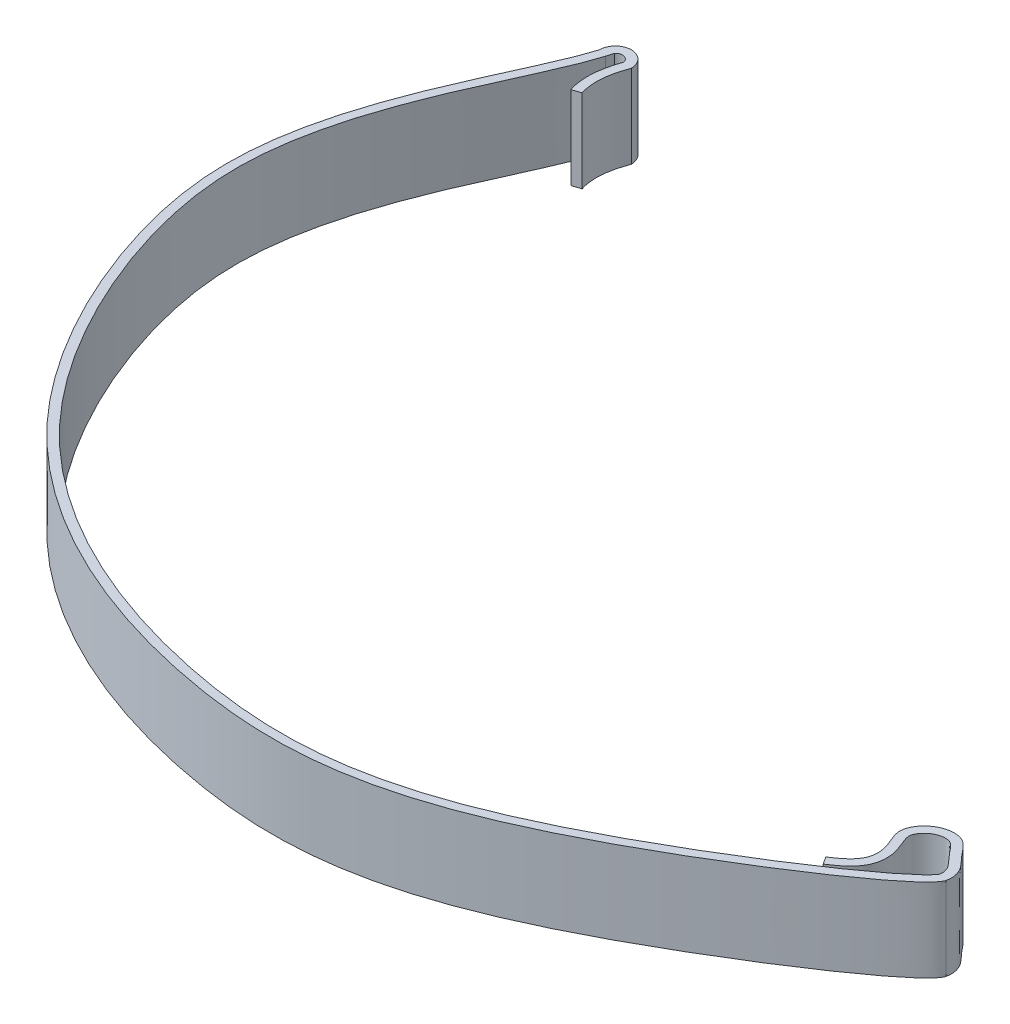
ISO-10303-21;
HEADER;
FILE_DESCRIPTION(('STEP AP214'),'2;1');
FILE_NAME('part.step','',(''),(''),'','','');
FILE_SCHEMA(('AUTOMOTIVE_DESIGN { 1 0 10303 214 1 1 1 1 }'));
ENDSEC;
DATA;
#1=APPLICATION_CONTEXT('core data for automotive mechanical design processes');
#2=APPLICATION_PROTOCOL_DEFINITION('international standard','automotive_design',2000,#1);
#3=PRODUCT_CONTEXT('',#1,'mechanical');
#4=PRODUCT('Part','Part','',(#3));
#5=PRODUCT_RELATED_PRODUCT_CATEGORY('part','',(#4));
#6=PRODUCT_DEFINITION_FORMATION('','',#4);
#7=PRODUCT_DEFINITION_CONTEXT('part definition',#1,'design');
#8=PRODUCT_DEFINITION('design','',#6,#7);
#9=PRODUCT_DEFINITION_SHAPE('','',#8);
#10=(LENGTH_UNIT() NAMED_UNIT(*) SI_UNIT(.MILLI.,.METRE.));
#11=(NAMED_UNIT(*) PLANE_ANGLE_UNIT() SI_UNIT($,.RADIAN.));
#12=(NAMED_UNIT(*) SI_UNIT($,.STERADIAN.) SOLID_ANGLE_UNIT());
#13=UNCERTAINTY_MEASURE_WITH_UNIT(LENGTH_MEASURE(1.E-05),#10,'distance_accuracy_value','');
#14=(GEOMETRIC_REPRESENTATION_CONTEXT(3) GLOBAL_UNCERTAINTY_ASSIGNED_CONTEXT((#13)) GLOBAL_UNIT_ASSIGNED_CONTEXT((#10,
#11,#12)) REPRESENTATION_CONTEXT('',''));
#15=CARTESIAN_POINT('',(0.,0.,0.));
#16=DIRECTION('',(0.,0.,1.));
#17=DIRECTION('',(1.,0.,0.));
#18=AXIS2_PLACEMENT_3D('',#15,#16,#17);
#19=CARTESIAN_POINT('',(94.0066656422718,14.,-10.9398372517862));
#20=CARTESIAN_POINT('',(94.0471251300807,14.,-11.1010481212494));
#21=CARTESIAN_POINT('',(94.0800016351362,14.,-11.4191849300879));
#22=CARTESIAN_POINT('',(93.9917776622486,14.,-11.9967623469634));
#23=CARTESIAN_POINT('',(93.7878079625354,14.,-12.4934423113869));
#24=CARTESIAN_POINT('',(93.4350248525155,14.,-12.9867497881263));
#25=CARTESIAN_POINT('',(92.876442091452,14.,-13.5876331248368));
#26=CARTESIAN_POINT('',(92.1574266539098,14.,-14.3681340525329));
#27=CARTESIAN_POINT('',(91.5439879783252,14.,-15.1578500905497));
#28=CARTESIAN_POINT('',(91.009634751994,14.,-15.8159884814287));
#29=CARTESIAN_POINT('',(90.5207790091255,14.,-16.293163239713));
#30=CARTESIAN_POINT('',(90.143666007239,14.,-16.5335759638733));
#31=CARTESIAN_POINT('',(89.679905116593,14.,-16.6747846550239));
#32=CARTESIAN_POINT('',(88.8749540082731,14.,-16.7167499015573));
#33=CARTESIAN_POINT('',(87.7335789571478,14.,-16.4216760619905));
#34=CARTESIAN_POINT('',(86.737022973381,14.,-15.6619642656265));
#35=CARTESIAN_POINT('',(86.1845488002609,14.,-14.9296165947175));
#36=CARTESIAN_POINT('',(85.9358591644071,14.,-14.3852983890064));
#37=CARTESIAN_POINT('',(85.8569634627461,14.,-13.9472760877937));
#38=CARTESIAN_POINT('',(85.902325330398,14.,-13.5326849558173));
#39=CARTESIAN_POINT('',(86.1203556237079,14.,-12.8592721836979));
#40=CARTESIAN_POINT('',(86.4770840370334,14.,-12.0299593684926));
#41=CARTESIAN_POINT('',(86.8784451989153,14.,-11.0269691118288));
#42=CARTESIAN_POINT('',(87.1650054257999,14.,-9.85035892107503));
#43=CARTESIAN_POINT('',(87.2405050385131,14.,-8.64999768387701));
#44=CARTESIAN_POINT('',(87.0818941394435,14.,-7.41836322487745));
#45=CARTESIAN_POINT('',(86.6100974345486,14.,-6.22438186312387));
#46=CARTESIAN_POINT('',(85.9381941655456,14.,-5.24262753026347));
#47=CARTESIAN_POINT('',(85.1575232671571,14.,-4.41206138085224));
#48=CARTESIAN_POINT('',(84.3305461948477,14.,-3.71066209422711));
#49=CARTESIAN_POINT('',(83.4913510750879,14.,-3.10371430899059));
#50=CARTESIAN_POINT('',(82.9951261635802,14.,-2.77855598688087));
#51=CARTESIAN_POINT('',(82.7354705416507,14.,-2.61161318088103));
#52=B_SPLINE_CURVE_WITH_KNOTS('',3,(#19,#20,#21,#22,#23,#24,#25,#26,#27,#28,#29,#30,#31,#32,#33,
#34,#35,#36,#37,#38,#39,#40,#41,#42,#43,#44,#45,#46,#47,#48,#49,#50,#51),.UNSPECIFIED.,.F.,.F.,
(4,1,1,1,1,1,1,1,1,1,1,1,1,1,1,1,1,1,1,1,1,1,1,1,1,1,1,1,1,1,4),(0.000545476492794976,
0.0317784303523951,0.0630113842119953,0.0942443380715955,0.125477291931196,0.156710245790796,
0.187943199650396,0.219176153509996,0.250409107369596,0.281642061229196,0.312875015088797,
0.344107968948397,0.375340922807997,0.437806830527197,0.500272738246398,0.531505692105998,
0.562738645965598,0.593971599825198,0.625204553684798,0.656437507544398,0.687670461403998,
0.718903415263599,0.750136369123199,0.781369322982799,0.812602276842399,0.843835230701999,
0.875068184561599,0.9063011384212,0.9375340922808,0.9687670461404,1.),.UNSPECIFIED.);
#53=DIRECTION('',(0.,-1.,0.));
#54=VECTOR('',#53,1.);
#55=SURFACE_OF_LINEAR_EXTRUSION('',#52,#54);
#56=CARTESIAN_POINT('',(94.0066656422718,0.,-10.9398372517862));
#57=CARTESIAN_POINT('',(94.0471251300807,0.,-11.1010481212494));
#58=CARTESIAN_POINT('',(94.0800016351362,0.,-11.4191849300879));
#59=CARTESIAN_POINT('',(93.9917776622486,0.,-11.9967623469634));
#60=CARTESIAN_POINT('',(93.7878079625354,0.,-12.4934423113869));
#61=CARTESIAN_POINT('',(93.4350248525155,0.,-12.9867497881263));
#62=CARTESIAN_POINT('',(92.876442091452,0.,-13.5876331248368));
#63=CARTESIAN_POINT('',(92.1574266539098,0.,-14.3681340525329));
#64=CARTESIAN_POINT('',(91.5439879783252,0.,-15.1578500905497));
#65=CARTESIAN_POINT('',(91.009634751994,0.,-15.8159884814287));
#66=CARTESIAN_POINT('',(90.5207790091255,0.,-16.293163239713));
#67=CARTESIAN_POINT('',(90.143666007239,0.,-16.5335759638733));
#68=CARTESIAN_POINT('',(89.679905116593,0.,-16.6747846550239));
#69=CARTESIAN_POINT('',(88.8749540082731,0.,-16.7167499015573));
#70=CARTESIAN_POINT('',(87.7335789571478,0.,-16.4216760619905));
#71=CARTESIAN_POINT('',(86.737022973381,0.,-15.6619642656265));
#72=CARTESIAN_POINT('',(86.1845488002609,0.,-14.9296165947175));
#73=CARTESIAN_POINT('',(85.9358591644071,0.,-14.3852983890064));
#74=CARTESIAN_POINT('',(85.8569634627461,0.,-13.9472760877937));
#75=CARTESIAN_POINT('',(85.902325330398,0.,-13.5326849558173));
#76=CARTESIAN_POINT('',(86.1203556237079,0.,-12.8592721836979));
#77=CARTESIAN_POINT('',(86.4770840370334,0.,-12.0299593684926));
#78=CARTESIAN_POINT('',(86.8784451989153,0.,-11.0269691118288));
#79=CARTESIAN_POINT('',(87.1650054257999,0.,-9.85035892107503));
#80=CARTESIAN_POINT('',(87.2405050385131,0.,-8.64999768387701));
#81=CARTESIAN_POINT('',(87.0818941394435,0.,-7.41836322487745));
#82=CARTESIAN_POINT('',(86.6100974345486,0.,-6.22438186312387));
#83=CARTESIAN_POINT('',(85.9381941655456,0.,-5.24262753026347));
#84=CARTESIAN_POINT('',(85.1575232671571,0.,-4.41206138085224));
#85=CARTESIAN_POINT('',(84.3305461948477,0.,-3.71066209422711));
#86=CARTESIAN_POINT('',(83.4913510750879,0.,-3.10371430899059));
#87=CARTESIAN_POINT('',(82.9951261635802,0.,-2.77855598688087));
#88=CARTESIAN_POINT('',(82.7354705416507,0.,-2.61161318088103));
#89=B_SPLINE_CURVE_WITH_KNOTS('',3,(#56,#57,#58,#59,#60,#61,#62,#63,#64,#65,#66,#67,#68,#69,#70,
#71,#72,#73,#74,#75,#76,#77,#78,#79,#80,#81,#82,#83,#84,#85,#86,#87,#88),.UNSPECIFIED.,.F.,.F.,
(4,1,1,1,1,1,1,1,1,1,1,1,1,1,1,1,1,1,1,1,1,1,1,1,1,1,1,1,1,1,4),(0.000545476492794976,
0.0317784303523951,0.0630113842119953,0.0942443380715955,0.125477291931196,0.156710245790796,
0.187943199650396,0.219176153509996,0.250409107369596,0.281642061229196,0.312875015088797,
0.344107968948397,0.375340922807997,0.437806830527197,0.500272738246398,0.531505692105998,
0.562738645965598,0.593971599825198,0.625204553684798,0.656437507544398,0.687670461403998,
0.718903415263599,0.750136369123199,0.781369322982799,0.812602276842399,0.843835230701999,
0.875068184561599,0.9063011384212,0.9375340922808,0.9687670461404,1.),.UNSPECIFIED.);
#90=CARTESIAN_POINT('',(94.0066656422718,0.,-10.9398372517861));
#91=VERTEX_POINT('',#90);
#92=CARTESIAN_POINT('',(82.7354705416507,0.,-2.61161318088102));
#93=VERTEX_POINT('',#92);
#94=EDGE_CURVE('E261',#91,#93,#89,.T.);
#95=ORIENTED_EDGE('',*,*,#94,.F.);
#96=DIRECTION('',(0.,-1.,0.));
#97=VECTOR('',#96,1.);
#98=CARTESIAN_POINT('',(94.0066656422718,14.,-10.9398372517861));
#99=LINE('',#98,#97);
#100=CARTESIAN_POINT('',(94.0066656422718,14.,-10.9398372517861));
#101=VERTEX_POINT('',#100);
#102=EDGE_CURVE('E11',#101,#91,#99,.T.);
#103=ORIENTED_EDGE('',*,*,#102,.F.);
#104=CARTESIAN_POINT('',(82.7354705416507,14.,-2.61161318088102));
#105=VERTEX_POINT('',#104);
#106=EDGE_CURVE('E218',#101,#105,#52,.T.);
#107=ORIENTED_EDGE('',*,*,#106,.T.);
#108=DIRECTION('',(0.,-1.,0.));
#109=VECTOR('',#108,1.);
#110=CARTESIAN_POINT('',(82.7354705416507,14.,-2.61161318088102));
#111=LINE('',#110,#109);
#112=EDGE_CURVE('E95',#105,#93,#111,.T.);
#113=ORIENTED_EDGE('',*,*,#112,.T.);
#114=EDGE_LOOP('',(#95,#103,#107,#113));
#115=FACE_BOUND('',#114,.T.);
#116=ADVANCED_FACE('F34',(#115),#55,.T.);
#117=CARTESIAN_POINT('',(-53.3740274801324,14.,-102.06901634249));
#118=CARTESIAN_POINT('',(-53.4764377875242,14.,-101.723875566234));
#119=CARTESIAN_POINT('',(-53.6908297089576,14.,-101.050324622514));
#120=CARTESIAN_POINT('',(-54.1965862909882,14.,-99.6164943236534));
#121=CARTESIAN_POINT('',(-54.9412613546853,14.,-97.7294236689653));
#122=CARTESIAN_POINT('',(-55.9875291511296,14.,-95.2914625413846));
#123=CARTESIAN_POINT('',(-57.5394723013004,14.,-91.824472463915));
#124=CARTESIAN_POINT('',(-59.6914012481426,14.,-87.1004251614999));
#125=CARTESIAN_POINT('',(-62.3436199884836,14.,-80.8882807310135));
#126=CARTESIAN_POINT('',(-64.7955325861202,14.,-74.2222185543412));
#127=CARTESIAN_POINT('',(-66.7771804599983,14.,-67.204536469742));
#128=CARTESIAN_POINT('',(-68.0249704810733,14.,-59.9114499532422));
#129=CARTESIAN_POINT('',(-68.2714479810985,14.,-52.5214353276667));
#130=CARTESIAN_POINT('',(-67.3143559327158,14.,-44.6536593490682));
#131=CARTESIAN_POINT('',(-65.0322507575667,14.,-35.872329415098));
#132=CARTESIAN_POINT('',(-61.5479510872573,14.,-26.7347681884239));
#133=CARTESIAN_POINT('',(-56.9667773225228,14.,-17.6553429643827));
#134=CARTESIAN_POINT('',(-51.4036739083796,14.,-9.06516226440402));
#135=CARTESIAN_POINT('',(-44.9852624374603,14.,-1.43384728439155));
#136=CARTESIAN_POINT('',(-37.8115635640725,14.,4.98583174601689));
#137=CARTESIAN_POINT('',(-27.4872782470266,14.,12.1186366871095));
#138=CARTESIAN_POINT('',(-13.6424828213182,14.,18.5255541477824));
#139=CARTESIAN_POINT('',(2.96791202352317,14.,22.8405181566522));
#140=CARTESIAN_POINT('',(17.8028318026194,14.,24.446531248152));
#141=CARTESIAN_POINT('',(29.7278890436588,14.,23.2328482479586));
#142=CARTESIAN_POINT('',(39.8180909154585,14.,20.5008119955434));
#143=CARTESIAN_POINT('',(47.8389841072376,14.,17.5062189182163));
#144=CARTESIAN_POINT('',(55.0519298033798,14.,14.1697829345902));
#145=CARTESIAN_POINT('',(61.2213351295907,14.,10.9690107737902));
#146=CARTESIAN_POINT('',(67.7005724955399,14.,7.39557149706477));
#147=CARTESIAN_POINT('',(74.3545837903421,14.,3.44347144225694));
#148=CARTESIAN_POINT('',(80.5321722881359,14.,-0.482717186110683));
#149=CARTESIAN_POINT('',(84.7668413789204,14.,-3.31413009282212));
#150=CARTESIAN_POINT('',(87.8272570364156,14.,-5.49363769287264));
#151=CARTESIAN_POINT('',(89.9098688689539,14.,-7.07478018717368));
#152=CARTESIAN_POINT('',(91.2664049212076,14.,-8.16420903410842));
#153=CARTESIAN_POINT('',(92.393202797456,14.,-9.13951035699096));
#154=CARTESIAN_POINT('',(93.1176453913723,14.,-9.83836104875602));
#155=CARTESIAN_POINT('',(93.5501271992501,14.,-10.308220763038));
#156=CARTESIAN_POINT('',(93.795500225761,14.,-10.6073303450426));
#157=CARTESIAN_POINT('',(93.9268687590777,14.,-10.7958573517177));
#158=CARTESIAN_POINT('',(93.9890749136155,14.,-10.9033275704517));
#159=CARTESIAN_POINT('',(93.999765161987,14.,-10.9246464235956));
#160=CARTESIAN_POINT('',(94.0066656422718,14.,-10.9398372517861));
#161=B_SPLINE_CURVE_WITH_KNOTS('',3,(#117,#118,#119,#120,#121,#122,#123,#124,#125,#126,#127,
#128,#129,#130,#131,#132,#133,#134,#135,#136,#137,#138,#139,#140,#141,#142,#143,#144,#145,#146,
#147,#148,#149,#150,#151,#152,#153,#154,#155,#156,#157,#158,#159,#160),.UNSPECIFIED.,.F.,.F.,(4,
1,1,1,1,1,1,1,1,1,1,1,1,1,1,1,1,1,1,1,1,1,1,1,1,1,1,1,1,1,1,1,1,1,1,1,1,1,1,1,1,4),(0.,
0.00778491802148371,0.0155698360429674,0.0311396720859348,0.0467095081289022,0.0622793441718697,
0.0934190162578045,0.124558688343739,0.155698360429674,0.186838032515609,0.217977704601544,
0.249117376687479,0.280257048773414,0.311396720859348,0.342536392945283,0.373676065031218,
0.404815737117153,0.435955409203088,0.467095081289022,0.498234753374957,0.560514097546827,
0.622793441718697,0.685072785890566,0.747352130062436,0.778491802148371,0.809631474234306,
0.84077114632024,0.856340982363208,0.871910818406175,0.90305049049211,0.918620326535077,
0.934190162578045,0.949759998621012,0.957544916642496,0.96532983466398,0.973114752685464,
0.980899670706947,0.984792129717689,0.988684588728431,0.992577047739173,0.994523277244544,
0.996469506749915),.UNSPECIFIED.);
#162=DIRECTION('',(0.,-1.,0.));
#163=VECTOR('',#162,1.);
#164=SURFACE_OF_LINEAR_EXTRUSION('',#161,#163);
#165=CARTESIAN_POINT('',(-53.3740274801324,0.,-102.06901634249));
#166=CARTESIAN_POINT('',(-53.4764377875242,0.,-101.723875566234));
#167=CARTESIAN_POINT('',(-53.6908297089576,0.,-101.050324622514));
#168=CARTESIAN_POINT('',(-54.1965862909882,0.,-99.6164943236534));
#169=CARTESIAN_POINT('',(-54.9412613546853,0.,-97.7294236689653));
#170=CARTESIAN_POINT('',(-55.9875291511296,0.,-95.2914625413846));
#171=CARTESIAN_POINT('',(-57.5394723013004,0.,-91.824472463915));
#172=CARTESIAN_POINT('',(-59.6914012481426,0.,-87.1004251614999));
#173=CARTESIAN_POINT('',(-62.3436199884836,0.,-80.8882807310135));
#174=CARTESIAN_POINT('',(-64.7955325861202,0.,-74.2222185543412));
#175=CARTESIAN_POINT('',(-66.7771804599983,0.,-67.204536469742));
#176=CARTESIAN_POINT('',(-68.0249704810733,0.,-59.9114499532422));
#177=CARTESIAN_POINT('',(-68.2714479810985,0.,-52.5214353276667));
#178=CARTESIAN_POINT('',(-67.3143559327158,0.,-44.6536593490682));
#179=CARTESIAN_POINT('',(-65.0322507575667,0.,-35.872329415098));
#180=CARTESIAN_POINT('',(-61.5479510872573,0.,-26.7347681884239));
#181=CARTESIAN_POINT('',(-56.9667773225228,0.,-17.6553429643827));
#182=CARTESIAN_POINT('',(-51.4036739083796,0.,-9.06516226440402));
#183=CARTESIAN_POINT('',(-44.9852624374603,0.,-1.43384728439155));
#184=CARTESIAN_POINT('',(-37.8115635640725,0.,4.98583174601689));
#185=CARTESIAN_POINT('',(-27.4872782470266,0.,12.1186366871095));
#186=CARTESIAN_POINT('',(-13.6424828213182,0.,18.5255541477824));
#187=CARTESIAN_POINT('',(2.96791202352317,0.,22.8405181566522));
#188=CARTESIAN_POINT('',(17.8028318026194,0.,24.446531248152));
#189=CARTESIAN_POINT('',(29.7278890436588,0.,23.2328482479586));
#190=CARTESIAN_POINT('',(39.8180909154585,0.,20.5008119955434));
#191=CARTESIAN_POINT('',(47.8389841072376,0.,17.5062189182163));
#192=CARTESIAN_POINT('',(55.0519298033798,0.,14.1697829345902));
#193=CARTESIAN_POINT('',(61.2213351295907,0.,10.9690107737902));
#194=CARTESIAN_POINT('',(67.7005724955399,0.,7.39557149706477));
#195=CARTESIAN_POINT('',(74.3545837903421,0.,3.44347144225694));
#196=CARTESIAN_POINT('',(80.5321722881359,0.,-0.482717186110683));
#197=CARTESIAN_POINT('',(84.7668413789204,0.,-3.31413009282212));
#198=CARTESIAN_POINT('',(87.8272570364156,0.,-5.49363769287264));
#199=CARTESIAN_POINT('',(89.9098688689539,0.,-7.07478018717368));
#200=CARTESIAN_POINT('',(91.2664049212076,0.,-8.16420903410842));
#201=CARTESIAN_POINT('',(92.393202797456,0.,-9.13951035699096));
#202=CARTESIAN_POINT('',(93.1176453913723,0.,-9.83836104875602));
#203=CARTESIAN_POINT('',(93.5501271992501,0.,-10.308220763038));
#204=CARTESIAN_POINT('',(93.795500225761,0.,-10.6073303450426));
#205=CARTESIAN_POINT('',(93.9268687590777,0.,-10.7958573517177));
#206=CARTESIAN_POINT('',(93.9890749136155,0.,-10.9033275704517));
#207=CARTESIAN_POINT('',(93.999765161987,0.,-10.9246464235956));
#208=CARTESIAN_POINT('',(94.0066656422718,0.,-10.9398372517861));
#209=B_SPLINE_CURVE_WITH_KNOTS('',3,(#165,#166,#167,#168,#169,#170,#171,#172,#173,#174,#175,
#176,#177,#178,#179,#180,#181,#182,#183,#184,#185,#186,#187,#188,#189,#190,#191,#192,#193,#194,
#195,#196,#197,#198,#199,#200,#201,#202,#203,#204,#205,#206,#207,#208),.UNSPECIFIED.,.F.,.F.,(4,
1,1,1,1,1,1,1,1,1,1,1,1,1,1,1,1,1,1,1,1,1,1,1,1,1,1,1,1,1,1,1,1,1,1,1,1,1,1,1,1,4),(0.,
0.00778491802148371,0.0155698360429674,0.0311396720859348,0.0467095081289022,0.0622793441718697,
0.0934190162578045,0.124558688343739,0.155698360429674,0.186838032515609,0.217977704601544,
0.249117376687479,0.280257048773414,0.311396720859348,0.342536392945283,0.373676065031218,
0.404815737117153,0.435955409203088,0.467095081289022,0.498234753374957,0.560514097546827,
0.622793441718697,0.685072785890566,0.747352130062436,0.778491802148371,0.809631474234306,
0.84077114632024,0.856340982363208,0.871910818406175,0.90305049049211,0.918620326535077,
0.934190162578045,0.949759998621012,0.957544916642496,0.96532983466398,0.973114752685464,
0.980899670706947,0.984792129717689,0.988684588728431,0.992577047739173,0.994523277244544,
0.996469506749915),.UNSPECIFIED.);
#210=CARTESIAN_POINT('',(-53.3740274801324,0.,-102.06901634249));
#211=VERTEX_POINT('',#210);
#212=EDGE_CURVE('E258',#211,#91,#209,.T.);
#213=ORIENTED_EDGE('',*,*,#212,.F.);
#214=DIRECTION('',(0.,-1.,0.));
#215=VECTOR('',#214,1.);
#216=CARTESIAN_POINT('',(-53.3740274801324,14.,-102.06901634249));
#217=LINE('',#216,#215);
#218=CARTESIAN_POINT('',(-53.3740274801324,14.,-102.06901634249));
#219=VERTEX_POINT('',#218);
#220=EDGE_CURVE('E43',#219,#211,#217,.T.);
#221=ORIENTED_EDGE('',*,*,#220,.F.);
#222=EDGE_CURVE('E212',#219,#101,#161,.T.);
#223=ORIENTED_EDGE('',*,*,#222,.T.);
#224=ORIENTED_EDGE('',*,*,#102,.T.);
#225=EDGE_LOOP('',(#213,#221,#223,#224));
#226=FACE_BOUND('',#225,.T.);
#227=ADVANCED_FACE('F207',(#226),#164,.T.);
#228=CARTESIAN_POINT('',(-76.4081711121234,14.,-21.9738090016365));
#229=DIRECTION('',(-0.961047724949368,0.,-0.276382471169291));
#230=DIRECTION('',(-0.276382471169291,0.,0.961047724949368));
#231=AXIS2_PLACEMENT_3D('',#228,#229,#230);
#232=PLANE('',#231);
#233=DIRECTION('',(0.276382471169291,0.,-0.961047724949368));
#234=VECTOR('',#233,1.);
#235=CARTESIAN_POINT('',(-76.4081711121234,0.,-21.9738090016365));
#236=LINE('',#235,#234);
#237=CARTESIAN_POINT('',(-53.0309569700507,0.,-103.261954273092));
#238=VERTEX_POINT('',#237);
#239=EDGE_CURVE('E251',#211,#238,#236,.T.);
#240=ORIENTED_EDGE('',*,*,#239,.T.);
#241=DIRECTION('',(0.,-1.,0.));
#242=VECTOR('',#241,1.);
#243=CARTESIAN_POINT('',(-53.0309569700507,14.,-103.261954273092));
#244=LINE('',#243,#242);
#245=CARTESIAN_POINT('',(-53.0309569700507,14.,-103.261954273092));
#246=VERTEX_POINT('',#245);
#247=EDGE_CURVE('E231',#246,#238,#244,.T.);
#248=ORIENTED_EDGE('',*,*,#247,.F.);
#249=DIRECTION('',(0.276382471169291,0.,-0.961047724949368));
#250=VECTOR('',#249,1.);
#251=CARTESIAN_POINT('',(-76.4081711121234,14.,-21.9738090016365));
#252=LINE('',#251,#250);
#253=EDGE_CURVE('E217',#219,#246,#252,.T.);
#254=ORIENTED_EDGE('',*,*,#253,.F.);
#255=ORIENTED_EDGE('',*,*,#220,.T.);
#256=EDGE_LOOP('',(#240,#248,#254,#255));
#257=FACE_BOUND('',#256,.T.);
#258=ADVANCED_FACE('F204',(#257),#232,.F.);
#259=CARTESIAN_POINT('',(-52.1271674376591,14.,-102.495709451401));
#260=DIRECTION('',(0.,-1.,0.));
#261=DIRECTION('',(0.,0.,-1.));
#262=AXIS2_PLACEMENT_3D('',#259,#260,#261);
#263=CYLINDRICAL_SURFACE('',#262,1.18489098470235);
#264=CARTESIAN_POINT('',(-52.1271674376591,0.,-102.495709451401));
#265=DIRECTION('',(0.,1.,0.));
#266=DIRECTION('',(0.,0.,1.));
#267=AXIS2_PLACEMENT_3D('',#264,#265,#266);
#268=CIRCLE('',#267,1.18489098470235);
#269=CARTESIAN_POINT('',(-50.9622387359181,0.,-102.712291457784));
#270=VERTEX_POINT('',#269);
#271=EDGE_CURVE('E259',#270,#238,#268,.T.);
#272=ORIENTED_EDGE('',*,*,#271,.F.);
#273=DIRECTION('',(0.,-1.,0.));
#274=VECTOR('',#273,1.);
#275=CARTESIAN_POINT('',(-50.9622387359181,14.,-102.712291457784));
#276=LINE('',#275,#274);
#277=CARTESIAN_POINT('',(-50.9622387359181,14.,-102.712291457784));
#278=VERTEX_POINT('',#277);
#279=EDGE_CURVE('E233',#278,#270,#276,.T.);
#280=ORIENTED_EDGE('',*,*,#279,.F.);
#281=CARTESIAN_POINT('',(-52.1271674376591,14.,-102.495709451401));
#282=DIRECTION('',(0.,1.,0.));
#283=DIRECTION('',(0.,0.,1.));
#284=AXIS2_PLACEMENT_3D('',#281,#282,#283);
#285=CIRCLE('',#284,1.18489098470235);
#286=EDGE_CURVE('E192',#278,#246,#285,.T.);
#287=ORIENTED_EDGE('',*,*,#286,.T.);
#288=ORIENTED_EDGE('',*,*,#247,.T.);
#289=EDGE_LOOP('',(#272,#280,#287,#288));
#290=FACE_BOUND('',#289,.T.);
#291=ADVANCED_FACE('F200',(#290),#263,.F.);
#292=CARTESIAN_POINT('',(-51.4136652224471,14.,-94.2890800259241));
#293=CARTESIAN_POINT('',(-51.6467849664898,14.,-94.9917280475839));
#294=CARTESIAN_POINT('',(-51.9478436857022,14.,-96.4713367435554));
#295=CARTESIAN_POINT('',(-51.9429350351131,14.,-98.6362460753619));
#296=CARTESIAN_POINT('',(-51.594687008365,14.,-100.749944969257));
#297=CARTESIAN_POINT('',(-51.1975321078687,14.,-102.062748830836));
#298=CARTESIAN_POINT('',(-50.9622387359182,14.,-102.712291457784));
#299=B_SPLINE_CURVE_WITH_KNOTS('',3,(#292,#293,#294,#295,#296,#297,#298),.UNSPECIFIED.,.F.,.F.,
(4,1,1,1,4),(0.0402949554358194,0.280221216576864,0.52014747771791,0.760073738858955,1.),.UNSPECIFIED.);
#300=DIRECTION('',(0.,-1.,0.));
#301=VECTOR('',#300,1.);
#302=SURFACE_OF_LINEAR_EXTRUSION('',#299,#301);
#303=CARTESIAN_POINT('',(-51.4136652224471,0.,-94.2890800259241));
#304=CARTESIAN_POINT('',(-51.6467849664898,0.,-94.9917280475839));
#305=CARTESIAN_POINT('',(-51.9478436857022,0.,-96.4713367435554));
#306=CARTESIAN_POINT('',(-51.9429350351131,0.,-98.6362460753619));
#307=CARTESIAN_POINT('',(-51.594687008365,0.,-100.749944969257));
#308=CARTESIAN_POINT('',(-51.1975321078687,0.,-102.062748830836));
#309=CARTESIAN_POINT('',(-50.9622387359182,0.,-102.712291457784));
#310=B_SPLINE_CURVE_WITH_KNOTS('',3,(#303,#304,#305,#306,#307,#308,#309),.UNSPECIFIED.,.F.,.F.,
(4,1,1,1,4),(0.0402949554358194,0.280221216576864,0.52014747771791,0.760073738858955,1.),.UNSPECIFIED.);
#311=CARTESIAN_POINT('',(-51.4136652224471,0.,-94.289080025924));
#312=VERTEX_POINT('',#311);
#313=EDGE_CURVE('E239',#312,#270,#310,.T.);
#314=ORIENTED_EDGE('',*,*,#313,.F.);
#315=DIRECTION('',(0.,-1.,0.));
#316=VECTOR('',#315,1.);
#317=CARTESIAN_POINT('',(-51.4136652224471,14.,-94.289080025924));
#318=LINE('',#317,#316);
#319=CARTESIAN_POINT('',(-51.4136652224471,14.,-94.289080025924));
#320=VERTEX_POINT('',#319);
#321=EDGE_CURVE('E237',#320,#312,#318,.T.);
#322=ORIENTED_EDGE('',*,*,#321,.F.);
#323=EDGE_CURVE('E186',#320,#278,#299,.T.);
#324=ORIENTED_EDGE('',*,*,#323,.T.);
#325=ORIENTED_EDGE('',*,*,#279,.T.);
#326=EDGE_LOOP('',(#314,#322,#324,#325));
#327=FACE_BOUND('',#326,.T.);
#328=ADVANCED_FACE('F197',(#327),#302,.T.);
#329=CARTESIAN_POINT('',(-33.2787560942134,14.,-100.305755863458));
#330=DIRECTION('',(0.314894719423947,0.,0.949126606770095));
#331=DIRECTION('',(0.949126606770095,0.,-0.314894719423947));
#332=AXIS2_PLACEMENT_3D('',#329,#330,#331);
#333=PLANE('',#332);
#334=DIRECTION('',(-0.949126606770095,0.,0.314894719423947));
#335=VECTOR('',#334,1.);
#336=CARTESIAN_POINT('',(-33.2787560942134,0.,-100.305755863458));
#337=LINE('',#336,#335);
#338=CARTESIAN_POINT('',(-49.9899753122919,0.,-94.76142210506));
#339=VERTEX_POINT('',#338);
#340=EDGE_CURVE('E275',#339,#312,#337,.T.);
#341=ORIENTED_EDGE('',*,*,#340,.F.);
#342=DIRECTION('',(0.,-1.,0.));
#343=VECTOR('',#342,1.);
#344=CARTESIAN_POINT('',(-49.9899753122919,14.,-94.76142210506));
#345=LINE('',#344,#343);
#346=CARTESIAN_POINT('',(-49.9899753122919,14.,-94.76142210506));
#347=VERTEX_POINT('',#346);
#348=EDGE_CURVE('E243',#347,#339,#345,.T.);
#349=ORIENTED_EDGE('',*,*,#348,.F.);
#350=DIRECTION('',(-0.949126606770095,0.,0.314894719423947));
#351=VECTOR('',#350,1.);
#352=CARTESIAN_POINT('',(-33.2787560942134,14.,-100.305755863458));
#353=LINE('',#352,#351);
#354=EDGE_CURVE('E180',#347,#320,#353,.T.);
#355=ORIENTED_EDGE('',*,*,#354,.T.);
#356=ORIENTED_EDGE('',*,*,#321,.T.);
#357=EDGE_LOOP('',(#341,#349,#355,#356));
#358=FACE_BOUND('',#357,.T.);
#359=ADVANCED_FACE('F171',(#358),#333,.T.);
#360=CARTESIAN_POINT('',(-49.4422764529568,14.,-102.495709451401));
#361=CARTESIAN_POINT('',(-50.3686707834958,14.,-100.076071934431));
#362=CARTESIAN_POINT('',(-50.8248393248325,14.,-97.2777921756239));
#363=CARTESIAN_POINT('',(-49.9899753122919,14.,-94.76142210506));
#364=B_SPLINE_CURVE_WITH_KNOTS('',3,(#360,#361,#362,#363),.UNSPECIFIED.,.F.,.F.,(4,4),(0.,1.),.UNSPECIFIED.);
#365=DIRECTION('',(0.,-1.,0.));
#366=VECTOR('',#365,1.);
#367=SURFACE_OF_LINEAR_EXTRUSION('',#364,#366);
#368=CARTESIAN_POINT('',(-49.4422764529568,0.,-102.495709451401));
#369=CARTESIAN_POINT('',(-50.3686707834958,0.,-100.076071934431));
#370=CARTESIAN_POINT('',(-50.8248393248325,0.,-97.2777921756239));
#371=CARTESIAN_POINT('',(-49.9899753122919,0.,-94.76142210506));
#372=B_SPLINE_CURVE_WITH_KNOTS('',3,(#368,#369,#370,#371),.UNSPECIFIED.,.F.,.F.,(4,4),(0.,1.),.UNSPECIFIED.);
#373=CARTESIAN_POINT('',(-49.4422764529568,0.,-102.495709451401));
#374=VERTEX_POINT('',#373);
#375=EDGE_CURVE('E280',#374,#339,#372,.T.);
#376=ORIENTED_EDGE('',*,*,#375,.F.);
#377=DIRECTION('',(0.,-1.,0.));
#378=VECTOR('',#377,1.);
#379=CARTESIAN_POINT('',(-49.4422764529568,14.,-102.495709451401));
#380=LINE('',#379,#378);
#381=CARTESIAN_POINT('',(-49.4422764529568,14.,-102.495709451401));
#382=VERTEX_POINT('',#381);
#383=EDGE_CURVE('E246',#382,#374,#380,.T.);
#384=ORIENTED_EDGE('',*,*,#383,.F.);
#385=EDGE_CURVE('E174',#382,#347,#364,.T.);
#386=ORIENTED_EDGE('',*,*,#385,.T.);
#387=ORIENTED_EDGE('',*,*,#348,.T.);
#388=EDGE_LOOP('',(#376,#384,#386,#387));
#389=FACE_BOUND('',#388,.T.);
#390=ADVANCED_FACE('F166',(#389),#367,.T.);
#391=CARTESIAN_POINT('',(-52.1271674376591,14.,-102.495709451401));
#392=DIRECTION('',(0.,-1.,0.));
#393=DIRECTION('',(0.,0.,-1.));
#394=AXIS2_PLACEMENT_3D('',#391,#392,#393);
#395=CYLINDRICAL_SURFACE('',#394,2.68489098470236);
#396=CARTESIAN_POINT('',(-52.1271674376591,0.,-102.495709451401));
#397=DIRECTION('',(0.,1.,0.));
#398=DIRECTION('',(0.,0.,1.));
#399=AXIS2_PLACEMENT_3D('',#396,#397,#398);
#400=CIRCLE('',#399,2.68489098470236);
#401=CARTESIAN_POINT('',(-54.8120584223615,0.,-102.495709451401));
#402=VERTEX_POINT('',#401);
#403=EDGE_CURVE('E285',#374,#402,#400,.T.);
#404=ORIENTED_EDGE('',*,*,#403,.T.);
#405=DIRECTION('',(0.,-1.,0.));
#406=VECTOR('',#405,1.);
#407=CARTESIAN_POINT('',(-54.8120584223615,14.,-102.495709451401));
#408=LINE('',#407,#406);
#409=CARTESIAN_POINT('',(-54.8120584223615,14.,-102.495709451401));
#410=VERTEX_POINT('',#409);
#411=EDGE_CURVE('E138',#410,#402,#408,.T.);
#412=ORIENTED_EDGE('',*,*,#411,.F.);
#413=CARTESIAN_POINT('',(-52.1271674376591,14.,-102.495709451401));
#414=DIRECTION('',(0.,1.,0.));
#415=DIRECTION('',(0.,0.,1.));
#416=AXIS2_PLACEMENT_3D('',#413,#414,#415);
#417=CIRCLE('',#416,2.68489098470236);
#418=EDGE_CURVE('E129',#382,#410,#417,.T.);
#419=ORIENTED_EDGE('',*,*,#418,.F.);
#420=ORIENTED_EDGE('',*,*,#383,.T.);
#421=EDGE_LOOP('',(#404,#412,#419,#420));
#422=FACE_BOUND('',#421,.T.);
#423=ADVANCED_FACE('F163',(#422),#395,.T.);
#424=CARTESIAN_POINT('',(-54.8120584223615,14.,-102.495709451401));
#425=CARTESIAN_POINT('',(-57.6013693524504,14.,-93.0952402589007));
#426=CARTESIAN_POINT('',(-70.8154529868417,14.,-72.6299266091196));
#427=CARTESIAN_POINT('',(-68.801239745649,14.,-37.1217155808505));
#428=CARTESIAN_POINT('',(-48.9097679219251,14.,7.40416410414951));
#429=CARTESIAN_POINT('',(9.54246144718299,14.,29.9258032959179));
#430=CARTESIAN_POINT('',(48.2923966219058,14.,23.1129683988087));
#431=CARTESIAN_POINT('',(94.7327422125886,14.,-7.56166864862375));
#432=CARTESIAN_POINT('',(95.4576463825642,14.,-10.5593346091656));
#433=B_SPLINE_CURVE_WITH_KNOTS('',3,(#424,#425,#426,#427,#428,#429,#430,#431,#432),
.UNSPECIFIED.,.F.,.F.,(4,1,1,1,1,1,4),(0.,0.230590410088737,0.273327635234085,0.427372251453478,
0.626139474144029,0.858257946768497,1.),.UNSPECIFIED.);
#434=DIRECTION('',(0.,-1.,0.));
#435=VECTOR('',#434,1.);
#436=SURFACE_OF_LINEAR_EXTRUSION('',#433,#435);
#437=CARTESIAN_POINT('',(-54.8120584223615,0.,-102.495709451401));
#438=CARTESIAN_POINT('',(-57.6013693524504,0.,-93.0952402589007));
#439=CARTESIAN_POINT('',(-70.8154529868417,0.,-72.6299266091196));
#440=CARTESIAN_POINT('',(-68.801239745649,0.,-37.1217155808505));
#441=CARTESIAN_POINT('',(-48.9097679219251,0.,7.40416410414951));
#442=CARTESIAN_POINT('',(9.54246144718299,0.,29.9258032959179));
#443=CARTESIAN_POINT('',(48.2923966219058,0.,23.1129683988087));
#444=CARTESIAN_POINT('',(94.7327422125886,0.,-7.56166864862375));
#445=CARTESIAN_POINT('',(95.4576463825642,0.,-10.5593346091656));
#446=B_SPLINE_CURVE_WITH_KNOTS('',3,(#437,#438,#439,#440,#441,#442,#443,#444,#445),
.UNSPECIFIED.,.F.,.F.,(4,1,1,1,1,1,4),(0.,0.230590410088737,0.273327635234085,0.427372251453478,
0.626139474144029,0.858257946768497,1.),.UNSPECIFIED.);
#447=CARTESIAN_POINT('',(95.4576463825642,0.,-10.5593346091656));
#448=VERTEX_POINT('',#447);
#449=EDGE_CURVE('E137',#402,#448,#446,.T.);
#450=ORIENTED_EDGE('',*,*,#449,.T.);
#451=DIRECTION('',(0.,-1.,0.));
#452=VECTOR('',#451,1.);
#453=CARTESIAN_POINT('',(95.4576463825642,14.,-10.5593346091656));
#454=LINE('',#453,#452);
#455=CARTESIAN_POINT('',(95.4576463825642,14.,-10.5593346091656));
#456=VERTEX_POINT('',#455);
#457=EDGE_CURVE('E134',#456,#448,#454,.T.);
#458=ORIENTED_EDGE('',*,*,#457,.F.);
#459=EDGE_CURVE('E122',#410,#456,#433,.T.);
#460=ORIENTED_EDGE('',*,*,#459,.F.);
#461=ORIENTED_EDGE('',*,*,#411,.T.);
#462=EDGE_LOOP('',(#450,#458,#460,#461));
#463=FACE_BOUND('',#462,.T.);
#464=ADVANCED_FACE('F135',(#463),#436,.F.);
#465=CARTESIAN_POINT('',(95.4576463825642,14.,-10.5593346091656));
#466=CARTESIAN_POINT('',(95.6782940129735,14.,-11.4194745329059));
#467=CARTESIAN_POINT('',(95.3722060075695,14.,-13.324665846506));
#468=CARTESIAN_POINT('',(93.1104102358157,14.,-15.3310583606709));
#469=CARTESIAN_POINT('',(91.2055762068015,14.,-18.4759130361175));
#470=CARTESIAN_POINT('',(86.5276222748489,14.,-18.1592200980133));
#471=CARTESIAN_POINT('',(83.4334891404365,14.,-14.1399151700687));
#472=CARTESIAN_POINT('',(85.7120058393842,14.,-10.7311584759371));
#473=CARTESIAN_POINT('',(85.8615462579749,14.,-6.55503886511148));
#474=CARTESIAN_POINT('',(83.2548747950764,14.,-4.72883777616719));
#475=CARTESIAN_POINT('',(81.9242608010885,14.,-3.87333373505178));
#476=B_SPLINE_CURVE_WITH_KNOTS('',3,(#465,#466,#467,#468,#469,#470,#471,#472,#473,#474,#475),
.UNSPECIFIED.,.F.,.F.,(4,1,1,1,1,1,1,1,4),(0.,0.0916573790865223,0.181034921152885,
0.30866968128261,0.439133419872435,0.597159990785832,0.72526051085672,0.823505514426261,1.),.UNSPECIFIED.);
#477=DIRECTION('',(0.,-1.,0.));
#478=VECTOR('',#477,1.);
#479=SURFACE_OF_LINEAR_EXTRUSION('',#476,#478);
#480=CARTESIAN_POINT('',(95.4576463825642,0.,-10.5593346091656));
#481=CARTESIAN_POINT('',(95.6782940129735,0.,-11.4194745329059));
#482=CARTESIAN_POINT('',(95.3722060075695,0.,-13.324665846506));
#483=CARTESIAN_POINT('',(93.1104102358157,0.,-15.3310583606709));
#484=CARTESIAN_POINT('',(91.2055762068015,0.,-18.4759130361175));
#485=CARTESIAN_POINT('',(86.5276222748489,0.,-18.1592200980133));
#486=CARTESIAN_POINT('',(83.4334891404365,0.,-14.1399151700687));
#487=CARTESIAN_POINT('',(85.7120058393842,0.,-10.7311584759371));
#488=CARTESIAN_POINT('',(85.8615462579749,0.,-6.55503886511148));
#489=CARTESIAN_POINT('',(83.2548747950764,0.,-4.72883777616719));
#490=CARTESIAN_POINT('',(81.9242608010885,0.,-3.87333373505178));
#491=B_SPLINE_CURVE_WITH_KNOTS('',3,(#480,#481,#482,#483,#484,#485,#486,#487,#488,#489,#490),
.UNSPECIFIED.,.F.,.F.,(4,1,1,1,1,1,1,1,4),(0.,0.0916573790865223,0.181034921152885,
0.30866968128261,0.439133419872435,0.597159990785832,0.72526051085672,0.823505514426261,1.),.UNSPECIFIED.);
#492=CARTESIAN_POINT('',(81.9242608010885,0.,-3.87333373505179));
#493=VERTEX_POINT('',#492);
#494=EDGE_CURVE('E88',#448,#493,#491,.T.);
#495=ORIENTED_EDGE('',*,*,#494,.T.);
#496=DIRECTION('',(0.,-1.,0.));
#497=VECTOR('',#496,1.);
#498=CARTESIAN_POINT('',(81.9242608010885,14.,-3.87333373505179));
#499=LINE('',#498,#497);
#500=CARTESIAN_POINT('',(81.9242608010885,14.,-3.87333373505179));
#501=VERTEX_POINT('',#500);
#502=EDGE_CURVE('E139',#501,#493,#499,.T.);
#503=ORIENTED_EDGE('',*,*,#502,.F.);
#504=EDGE_CURVE('E126',#456,#501,#476,.T.);
#505=ORIENTED_EDGE('',*,*,#504,.F.);
#506=ORIENTED_EDGE('',*,*,#457,.T.);
#507=EDGE_LOOP('',(#495,#503,#505,#506));
#508=FACE_BOUND('',#507,.T.);
#509=ADVANCED_FACE('F141',(#508),#479,.F.);
#510=CARTESIAN_POINT('',(59.7257068669088,14.,-38.4000046700071));
#511=DIRECTION('',(0.841147036113837,0.,-0.540806493708154));
#512=DIRECTION('',(-0.540806493708154,0.,-0.841147036113837));
#513=AXIS2_PLACEMENT_3D('',#510,#511,#512);
#514=PLANE('',#513);
#515=DIRECTION('',(0.540806493708154,0.,0.841147036113837));
#516=VECTOR('',#515,1.);
#517=CARTESIAN_POINT('',(59.7257068669088,0.,-38.4000046700071));
#518=LINE('',#517,#516);
#519=EDGE_CURVE('E299',#493,#93,#518,.T.);
#520=ORIENTED_EDGE('',*,*,#519,.T.);
#521=ORIENTED_EDGE('',*,*,#112,.F.);
#522=DIRECTION('',(0.540806493708154,0.,0.841147036113837));
#523=VECTOR('',#522,1.);
#524=CARTESIAN_POINT('',(59.7257068669088,14.,-38.4000046700071));
#525=LINE('',#524,#523);
#526=EDGE_CURVE('E51',#501,#105,#525,.T.);
#527=ORIENTED_EDGE('',*,*,#526,.F.);
#528=ORIENTED_EDGE('',*,*,#502,.T.);
#529=EDGE_LOOP('',(#520,#521,#527,#528));
#530=FACE_BOUND('',#529,.T.);
#531=ADVANCED_FACE('F159',(#530),#514,.F.);
#532=CARTESIAN_POINT('',(0.,14.,0.));
#533=DIRECTION('',(0.,1.,0.));
#534=DIRECTION('',(0.,0.,1.));
#535=AXIS2_PLACEMENT_3D('',#532,#533,#534);
#536=PLANE('',#535);
#537=ORIENTED_EDGE('',*,*,#106,.F.);
#538=ORIENTED_EDGE('',*,*,#222,.F.);
#539=ORIENTED_EDGE('',*,*,#253,.T.);
#540=ORIENTED_EDGE('',*,*,#286,.F.);
#541=ORIENTED_EDGE('',*,*,#323,.F.);
#542=ORIENTED_EDGE('',*,*,#354,.F.);
#543=ORIENTED_EDGE('',*,*,#385,.F.);
#544=ORIENTED_EDGE('',*,*,#418,.T.);
#545=ORIENTED_EDGE('',*,*,#459,.T.);
#546=ORIENTED_EDGE('',*,*,#504,.T.);
#547=ORIENTED_EDGE('',*,*,#526,.T.);
#548=EDGE_LOOP('',(#537,#538,#539,#540,#541,#542,#543,#544,#545,#546,#547));
#549=FACE_BOUND('',#548,.T.);
#550=ADVANCED_FACE('F124',(#549),#536,.T.);
#551=CARTESIAN_POINT('',(0.,0.,0.));
#552=DIRECTION('',(0.,1.,0.));
#553=DIRECTION('',(0.,0.,1.));
#554=AXIS2_PLACEMENT_3D('',#551,#552,#553);
#555=PLANE('',#554);
#556=ORIENTED_EDGE('',*,*,#94,.T.);
#557=ORIENTED_EDGE('',*,*,#519,.F.);
#558=ORIENTED_EDGE('',*,*,#494,.F.);
#559=ORIENTED_EDGE('',*,*,#449,.F.);
#560=ORIENTED_EDGE('',*,*,#403,.F.);
#561=ORIENTED_EDGE('',*,*,#375,.T.);
#562=ORIENTED_EDGE('',*,*,#340,.T.);
#563=ORIENTED_EDGE('',*,*,#313,.T.);
#564=ORIENTED_EDGE('',*,*,#271,.T.);
#565=ORIENTED_EDGE('',*,*,#239,.F.);
#566=ORIENTED_EDGE('',*,*,#212,.T.);
#567=EDGE_LOOP('',(#556,#557,#558,#559,#560,#561,#562,#563,#564,#565,#566));
#568=FACE_BOUND('',#567,.T.);
#569=ADVANCED_FACE('F257',(#568),#555,.F.);
#570=CLOSED_SHELL('',(#116,#227,#258,#291,#328,#359,#390,#423,#464,#509,#531,#550,#569));
#571=MANIFOLD_SOLID_BREP('B2',#570);
#572=ADVANCED_BREP_SHAPE_REPRESENTATION('',(#18,#571),#14);
#573=SHAPE_DEFINITION_REPRESENTATION(#9,#572);
ENDSEC;
END-ISO-10303-21;
